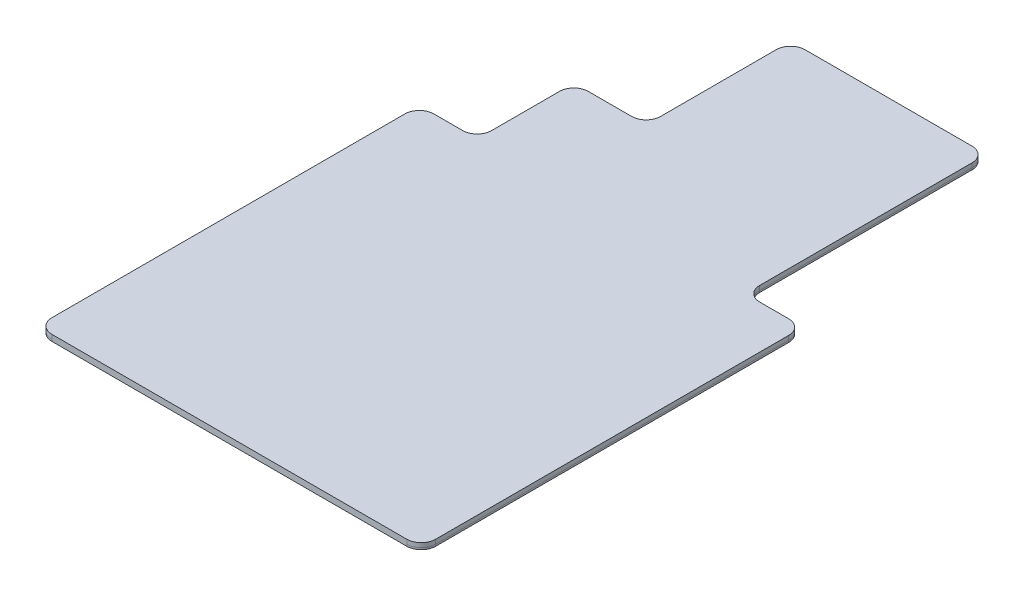
ISO-10303-21;
HEADER;
FILE_DESCRIPTION(('STEP AP214'),'2;1');
FILE_NAME('part.step','',(''),(''),'','','');
FILE_SCHEMA(('AUTOMOTIVE_DESIGN { 1 0 10303 214 1 1 1 1 }'));
ENDSEC;
DATA;
#1=APPLICATION_CONTEXT('core data for automotive mechanical design processes');
#2=APPLICATION_PROTOCOL_DEFINITION('international standard','automotive_design',2000,#1);
#3=PRODUCT_CONTEXT('',#1,'mechanical');
#4=PRODUCT('Part','Part','',(#3));
#5=PRODUCT_RELATED_PRODUCT_CATEGORY('part','',(#4));
#6=PRODUCT_DEFINITION_FORMATION('','',#4);
#7=PRODUCT_DEFINITION_CONTEXT('part definition',#1,'design');
#8=PRODUCT_DEFINITION('design','',#6,#7);
#9=PRODUCT_DEFINITION_SHAPE('','',#8);
#10=(LENGTH_UNIT() NAMED_UNIT(*) SI_UNIT(.MILLI.,.METRE.));
#11=(NAMED_UNIT(*) PLANE_ANGLE_UNIT() SI_UNIT($,.RADIAN.));
#12=(NAMED_UNIT(*) SI_UNIT($,.STERADIAN.) SOLID_ANGLE_UNIT());
#13=UNCERTAINTY_MEASURE_WITH_UNIT(LENGTH_MEASURE(1.E-05),#10,'distance_accuracy_value','');
#14=(GEOMETRIC_REPRESENTATION_CONTEXT(3) GLOBAL_UNCERTAINTY_ASSIGNED_CONTEXT((#13)) GLOBAL_UNIT_ASSIGNED_CONTEXT((#10,
#11,#12)) REPRESENTATION_CONTEXT('',''));
#15=CARTESIAN_POINT('',(0.,0.,0.));
#16=DIRECTION('',(0.,0.,1.));
#17=DIRECTION('',(1.,0.,0.));
#18=AXIS2_PLACEMENT_3D('',#15,#16,#17);
#19=CARTESIAN_POINT('',(-3.24677508544398,28.24732,30.4175989851035));
#20=DIRECTION('',(0.,1.,0.));
#21=DIRECTION('',(0.,0.,1.));
#22=AXIS2_PLACEMENT_3D('',#19,#20,#21);
#23=CYLINDRICAL_SURFACE('',#22,1.);
#24=DIRECTION('',(0.,1.,0.));
#25=VECTOR('',#24,1.);
#26=CARTESIAN_POINT('',(-4.24677508544398,27.82232,30.4175989851035));
#27=LINE('',#26,#25);
#28=CARTESIAN_POINT('',(-4.24677508544398,27.94732,30.4175989851035));
#29=VERTEX_POINT('',#28);
#30=CARTESIAN_POINT('',(-4.24677508544398,27.82232,30.4175989851035));
#31=VERTEX_POINT('',#30);
#32=EDGE_CURVE('E437',#29,#31,#27,.F.);
#33=ORIENTED_EDGE('',*,*,#32,.F.);
#34=CARTESIAN_POINT('',(-3.24677508544398,27.94732,30.4175989851035));
#35=DIRECTION('',(0.,1.,0.));
#36=DIRECTION('',(0.,0.,1.));
#37=AXIS2_PLACEMENT_3D('',#34,#35,#36);
#38=CIRCLE('',#37,1.);
#39=CARTESIAN_POINT('',(-3.24677508544398,27.94732,29.4175989851035));
#40=VERTEX_POINT('',#39);
#41=EDGE_CURVE('E11',#29,#40,#38,.F.);
#42=ORIENTED_EDGE('',*,*,#41,.T.);
#43=DIRECTION('',(0.,1.,0.));
#44=VECTOR('',#43,1.);
#45=CARTESIAN_POINT('',(-3.24677508544398,28.24732,29.4175989851035));
#46=LINE('',#45,#44);
#47=CARTESIAN_POINT('',(-3.24677508544398,27.82232,29.4175989851035));
#48=VERTEX_POINT('',#47);
#49=EDGE_CURVE('E466',#48,#40,#46,.T.);
#50=ORIENTED_EDGE('',*,*,#49,.F.);
#51=CARTESIAN_POINT('',(-3.24677508544398,27.82232,30.4175989851035));
#52=DIRECTION('',(0.,-1.,0.));
#53=DIRECTION('',(0.,0.,-1.));
#54=AXIS2_PLACEMENT_3D('',#51,#52,#53);
#55=CIRCLE('',#54,1.);
#56=EDGE_CURVE('E313',#31,#48,#55,.T.);
#57=ORIENTED_EDGE('',*,*,#56,.F.);
#58=EDGE_LOOP('',(#33,#42,#50,#57));
#59=FACE_BOUND('',#58,.T.);
#60=ADVANCED_FACE('F16',(#59),#23,.T.);
#61=CARTESIAN_POINT('',(-4.24677508544398,27.82232,29.4175989851035));
#62=DIRECTION('',(1.,0.,0.));
#63=DIRECTION('',(0.,0.,-1.));
#64=AXIS2_PLACEMENT_3D('',#61,#62,#63);
#65=PLANE('',#64);
#66=DIRECTION('',(0.,0.,1.));
#67=VECTOR('',#66,1.);
#68=CARTESIAN_POINT('',(-4.24677508544398,27.94732,29.4175989851035));
#69=LINE('',#68,#67);
#70=CARTESIAN_POINT('',(-4.24677508544398,27.94732,38.4175989851035));
#71=VERTEX_POINT('',#70);
#72=EDGE_CURVE('E25',#29,#71,#69,.T.);
#73=ORIENTED_EDGE('',*,*,#72,.F.);
#74=ORIENTED_EDGE('',*,*,#32,.T.);
#75=DIRECTION('',(0.,0.,-1.));
#76=VECTOR('',#75,1.);
#77=CARTESIAN_POINT('',(-4.24677508544398,27.82232,29.4175989851035));
#78=LINE('',#77,#76);
#79=CARTESIAN_POINT('',(-4.24677508544398,27.82232,38.4175989851035));
#80=VERTEX_POINT('',#79);
#81=EDGE_CURVE('E459',#80,#31,#78,.T.);
#82=ORIENTED_EDGE('',*,*,#81,.F.);
#83=DIRECTION('',(0.,1.,0.));
#84=VECTOR('',#83,1.);
#85=CARTESIAN_POINT('',(-4.24677508544398,28.24732,38.4175989851035));
#86=LINE('',#85,#84);
#87=EDGE_CURVE('E434',#80,#71,#86,.T.);
#88=ORIENTED_EDGE('',*,*,#87,.T.);
#89=EDGE_LOOP('',(#73,#74,#82,#88));
#90=FACE_BOUND('',#89,.T.);
#91=ADVANCED_FACE('F540',(#90),#65,.F.);
#92=CARTESIAN_POINT('',(-5.24677508544398,27.82232,38.4175989851035));
#93=DIRECTION('',(0.,-1.,0.));
#94=DIRECTION('',(0.,0.,-1.));
#95=AXIS2_PLACEMENT_3D('',#92,#93,#94);
#96=CYLINDRICAL_SURFACE('',#95,1.);
#97=CARTESIAN_POINT('',(-5.24677508544398,27.94732,38.4175989851035));
#98=DIRECTION('',(0.,1.,0.));
#99=DIRECTION('',(0.,0.,1.));
#100=AXIS2_PLACEMENT_3D('',#97,#98,#99);
#101=CIRCLE('',#100,1.);
#102=CARTESIAN_POINT('',(-5.24677508544398,27.94732,39.4175989851035));
#103=VERTEX_POINT('',#102);
#104=EDGE_CURVE('E288',#71,#103,#101,.F.);
#105=ORIENTED_EDGE('',*,*,#104,.F.);
#106=ORIENTED_EDGE('',*,*,#87,.F.);
#107=CARTESIAN_POINT('',(-5.24677508544398,27.82232,38.4175989851035));
#108=DIRECTION('',(0.,-1.,0.));
#109=DIRECTION('',(0.,0.,-1.));
#110=AXIS2_PLACEMENT_3D('',#107,#108,#109);
#111=CIRCLE('',#110,1.);
#112=CARTESIAN_POINT('',(-5.24677508544398,27.82232,39.4175989851035));
#113=VERTEX_POINT('',#112);
#114=EDGE_CURVE('E380',#113,#80,#111,.F.);
#115=ORIENTED_EDGE('',*,*,#114,.F.);
#116=DIRECTION('',(0.,1.,0.));
#117=VECTOR('',#116,1.);
#118=CARTESIAN_POINT('',(-5.24677508544398,27.82232,39.4175989851035));
#119=LINE('',#118,#117);
#120=EDGE_CURVE('E321',#103,#113,#119,.F.);
#121=ORIENTED_EDGE('',*,*,#120,.F.);
#122=EDGE_LOOP('',(#105,#106,#115,#121));
#123=FACE_BOUND('',#122,.T.);
#124=ADVANCED_FACE('F537',(#123),#96,.F.);
#125=CARTESIAN_POINT('',(-9.24677508544398,27.82232,39.4175989851035));
#126=DIRECTION('',(0.,0.,1.));
#127=DIRECTION('',(1.,0.,0.));
#128=AXIS2_PLACEMENT_3D('',#125,#126,#127);
#129=PLANE('',#128);
#130=DIRECTION('',(-1.,0.,0.));
#131=VECTOR('',#130,1.);
#132=CARTESIAN_POINT('',(-9.24677508544398,27.94732,39.4175989851035));
#133=LINE('',#132,#131);
#134=CARTESIAN_POINT('',(-8.24677508544398,27.94732,39.4175989851035));
#135=VERTEX_POINT('',#134);
#136=EDGE_CURVE('E289',#103,#135,#133,.T.);
#137=ORIENTED_EDGE('',*,*,#136,.F.);
#138=ORIENTED_EDGE('',*,*,#120,.T.);
#139=DIRECTION('',(1.,0.,0.));
#140=VECTOR('',#139,1.);
#141=CARTESIAN_POINT('',(-9.24677508544398,27.82232,39.4175989851035));
#142=LINE('',#141,#140);
#143=CARTESIAN_POINT('',(-8.24677508544398,27.82232,39.4175989851035));
#144=VERTEX_POINT('',#143);
#145=EDGE_CURVE('E320',#144,#113,#142,.T.);
#146=ORIENTED_EDGE('',*,*,#145,.F.);
#147=DIRECTION('',(0.,1.,0.));
#148=VECTOR('',#147,1.);
#149=CARTESIAN_POINT('',(-8.24677508544398,27.82232,39.4175989851035));
#150=LINE('',#149,#148);
#151=EDGE_CURVE('E301',#144,#135,#150,.T.);
#152=ORIENTED_EDGE('',*,*,#151,.T.);
#153=EDGE_LOOP('',(#137,#138,#146,#152));
#154=FACE_BOUND('',#153,.T.);
#155=ADVANCED_FACE('F317',(#154),#129,.F.);
#156=CARTESIAN_POINT('',(-8.24677508544398,27.82232,40.4175989851035));
#157=DIRECTION('',(0.,1.,0.));
#158=DIRECTION('',(0.,0.,1.));
#159=AXIS2_PLACEMENT_3D('',#156,#157,#158);
#160=CYLINDRICAL_SURFACE('',#159,1.);
#161=DIRECTION('',(0.,1.,0.));
#162=VECTOR('',#161,1.);
#163=CARTESIAN_POINT('',(-9.24677508544398,28.24732,40.4175989851035));
#164=LINE('',#163,#162);
#165=CARTESIAN_POINT('',(-9.24677508544398,27.94732,40.4175989851035));
#166=VERTEX_POINT('',#165);
#167=CARTESIAN_POINT('',(-9.24677508544398,27.82232,40.4175989851035));
#168=VERTEX_POINT('',#167);
#169=EDGE_CURVE('E302',#166,#168,#164,.F.);
#170=ORIENTED_EDGE('',*,*,#169,.F.);
#171=CARTESIAN_POINT('',(-8.24677508544398,27.94732,40.4175989851035));
#172=DIRECTION('',(0.,1.,0.));
#173=DIRECTION('',(0.,0.,1.));
#174=AXIS2_PLACEMENT_3D('',#171,#172,#173);
#175=CIRCLE('',#174,1.);
#176=EDGE_CURVE('E234',#166,#135,#175,.F.);
#177=ORIENTED_EDGE('',*,*,#176,.T.);
#178=ORIENTED_EDGE('',*,*,#151,.F.);
#179=CARTESIAN_POINT('',(-8.24677508544398,27.82232,40.4175989851035));
#180=DIRECTION('',(0.,-1.,0.));
#181=DIRECTION('',(0.,0.,-1.));
#182=AXIS2_PLACEMENT_3D('',#179,#180,#181);
#183=CIRCLE('',#182,1.);
#184=EDGE_CURVE('E449',#168,#144,#183,.T.);
#185=ORIENTED_EDGE('',*,*,#184,.F.);
#186=EDGE_LOOP('',(#170,#177,#178,#185));
#187=FACE_BOUND('',#186,.T.);
#188=ADVANCED_FACE('F298',(#187),#160,.T.);
#189=CARTESIAN_POINT('',(12.311291085444,28.24732,71.54165));
#190=DIRECTION('',(0.,-1.,0.));
#191=DIRECTION('',(0.,0.,-1.));
#192=AXIS2_PLACEMENT_3D('',#189,#190,#191);
#193=CYLINDRICAL_SURFACE('',#192,1.);
#194=DIRECTION('',(0.,-1.,0.));
#195=VECTOR('',#194,1.);
#196=CARTESIAN_POINT('',(13.311291085444,28.24732,71.54165));
#197=LINE('',#196,#195);
#198=CARTESIAN_POINT('',(13.311291085444,27.94732,71.54165));
#199=VERTEX_POINT('',#198);
#200=CARTESIAN_POINT('',(13.311291085444,27.82232,71.54165));
#201=VERTEX_POINT('',#200);
#202=EDGE_CURVE('E340',#199,#201,#197,.T.);
#203=ORIENTED_EDGE('',*,*,#202,.F.);
#204=CARTESIAN_POINT('',(12.311291085444,27.94732,71.54165));
#205=DIRECTION('',(0.,1.,0.));
#206=DIRECTION('',(0.,0.,1.));
#207=AXIS2_PLACEMENT_3D('',#204,#205,#206);
#208=CIRCLE('',#207,1.);
#209=CARTESIAN_POINT('',(12.311291085444,27.94732,72.54165));
#210=VERTEX_POINT('',#209);
#211=EDGE_CURVE('E229',#199,#210,#208,.F.);
#212=ORIENTED_EDGE('',*,*,#211,.T.);
#213=DIRECTION('',(0.,-1.,0.));
#214=VECTOR('',#213,1.);
#215=CARTESIAN_POINT('',(12.311291085444,28.24732,72.54165));
#216=LINE('',#215,#214);
#217=CARTESIAN_POINT('',(12.311291085444,27.82232,72.54165));
#218=VERTEX_POINT('',#217);
#219=EDGE_CURVE('E373',#218,#210,#216,.F.);
#220=ORIENTED_EDGE('',*,*,#219,.F.);
#221=CARTESIAN_POINT('',(12.311291085444,27.82232,71.54165));
#222=DIRECTION('',(0.,-1.,0.));
#223=DIRECTION('',(0.,0.,-1.));
#224=AXIS2_PLACEMENT_3D('',#221,#222,#223);
#225=CIRCLE('',#224,1.);
#226=EDGE_CURVE('E442',#201,#218,#225,.T.);
#227=ORIENTED_EDGE('',*,*,#226,.F.);
#228=EDGE_LOOP('',(#203,#212,#220,#227));
#229=FACE_BOUND('',#228,.T.);
#230=ADVANCED_FACE('F498',(#229),#193,.T.);
#231=CARTESIAN_POINT('',(13.311291085444,28.24732,72.54165));
#232=DIRECTION('',(-1.,0.,0.));
#233=DIRECTION('',(0.,0.,1.));
#234=AXIS2_PLACEMENT_3D('',#231,#232,#233);
#235=PLANE('',#234);
#236=DIRECTION('',(0.,0.,-1.));
#237=VECTOR('',#236,1.);
#238=CARTESIAN_POINT('',(13.311291085444,27.94732,72.54165));
#239=LINE('',#238,#237);
#240=CARTESIAN_POINT('',(13.311291085444,27.94732,47.1117784768324));
#241=VERTEX_POINT('',#240);
#242=EDGE_CURVE('E226',#199,#241,#239,.T.);
#243=ORIENTED_EDGE('',*,*,#242,.F.);
#244=ORIENTED_EDGE('',*,*,#202,.T.);
#245=DIRECTION('',(0.,0.,-1.));
#246=VECTOR('',#245,1.);
#247=CARTESIAN_POINT('',(13.311291085444,27.82232,72.54165));
#248=LINE('',#247,#246);
#249=CARTESIAN_POINT('',(13.311291085444,27.82232,47.1117784768324));
#250=VERTEX_POINT('',#249);
#251=EDGE_CURVE('E501',#201,#250,#248,.T.);
#252=ORIENTED_EDGE('',*,*,#251,.T.);
#253=DIRECTION('',(0.,-1.,0.));
#254=VECTOR('',#253,1.);
#255=CARTESIAN_POINT('',(13.311291085444,28.24732,47.1117784768324));
#256=LINE('',#255,#254);
#257=EDGE_CURVE('E345',#250,#241,#256,.F.);
#258=ORIENTED_EDGE('',*,*,#257,.T.);
#259=EDGE_LOOP('',(#243,#244,#252,#258));
#260=FACE_BOUND('',#259,.T.);
#261=ADVANCED_FACE('F495',(#260),#235,.F.);
#262=CARTESIAN_POINT('',(-12.246775085444,28.24732,71.54165));
#263=DIRECTION('',(0.,-1.,0.));
#264=DIRECTION('',(0.,0.,-1.));
#265=AXIS2_PLACEMENT_3D('',#262,#263,#264);
#266=CYLINDRICAL_SURFACE('',#265,1.);
#267=DIRECTION('',(0.,-1.,0.));
#268=VECTOR('',#267,1.);
#269=CARTESIAN_POINT('',(-12.246775085444,28.24732,72.54165));
#270=LINE('',#269,#268);
#271=CARTESIAN_POINT('',(-12.246775085444,27.94732,72.54165));
#272=VERTEX_POINT('',#271);
#273=CARTESIAN_POINT('',(-12.246775085444,27.82232,72.54165));
#274=VERTEX_POINT('',#273);
#275=EDGE_CURVE('E376',#272,#274,#270,.T.);
#276=ORIENTED_EDGE('',*,*,#275,.F.);
#277=CARTESIAN_POINT('',(-12.246775085444,27.94732,71.54165));
#278=DIRECTION('',(0.,1.,0.));
#279=DIRECTION('',(0.,0.,1.));
#280=AXIS2_PLACEMENT_3D('',#277,#278,#279);
#281=CIRCLE('',#280,1.);
#282=CARTESIAN_POINT('',(-13.246775085444,27.94732,71.54165));
#283=VERTEX_POINT('',#282);
#284=EDGE_CURVE('E227',#272,#283,#281,.F.);
#285=ORIENTED_EDGE('',*,*,#284,.T.);
#286=DIRECTION('',(0.,-1.,0.));
#287=VECTOR('',#286,1.);
#288=CARTESIAN_POINT('',(-13.246775085444,28.24732,71.54165));
#289=LINE('',#288,#287);
#290=CARTESIAN_POINT('',(-13.246775085444,27.82232,71.54165));
#291=VERTEX_POINT('',#290);
#292=EDGE_CURVE('E357',#291,#283,#289,.F.);
#293=ORIENTED_EDGE('',*,*,#292,.F.);
#294=CARTESIAN_POINT('',(-12.246775085444,27.82232,71.54165));
#295=DIRECTION('',(0.,-1.,0.));
#296=DIRECTION('',(0.,0.,-1.));
#297=AXIS2_PLACEMENT_3D('',#294,#295,#296);
#298=CIRCLE('',#297,1.);
#299=EDGE_CURVE('E440',#274,#291,#298,.T.);
#300=ORIENTED_EDGE('',*,*,#299,.F.);
#301=EDGE_LOOP('',(#276,#285,#293,#300));
#302=FACE_BOUND('',#301,.T.);
#303=ADVANCED_FACE('F623',(#302),#266,.T.);
#304=CARTESIAN_POINT('',(-13.246775085444,28.24732,72.54165));
#305=DIRECTION('',(1.,0.,0.));
#306=DIRECTION('',(0.,0.,-1.));
#307=AXIS2_PLACEMENT_3D('',#304,#305,#306);
#308=PLANE('',#307);
#309=DIRECTION('',(0.,0.,1.));
#310=VECTOR('',#309,1.);
#311=CARTESIAN_POINT('',(-13.246775085444,27.94732,72.54165));
#312=LINE('',#311,#310);
#313=CARTESIAN_POINT('',(-13.246775085444,27.94732,47.1117784768324));
#314=VERTEX_POINT('',#313);
#315=EDGE_CURVE('E231',#314,#283,#312,.T.);
#316=ORIENTED_EDGE('',*,*,#315,.F.);
#317=DIRECTION('',(0.,-1.,0.));
#318=VECTOR('',#317,1.);
#319=CARTESIAN_POINT('',(-13.246775085444,28.24732,47.1117784768324));
#320=LINE('',#319,#318);
#321=CARTESIAN_POINT('',(-13.246775085444,27.82232,47.1117784768324));
#322=VERTEX_POINT('',#321);
#323=EDGE_CURVE('E360',#314,#322,#320,.T.);
#324=ORIENTED_EDGE('',*,*,#323,.T.);
#325=DIRECTION('',(0.,0.,1.));
#326=VECTOR('',#325,1.);
#327=CARTESIAN_POINT('',(-13.246775085444,27.82232,72.54165));
#328=LINE('',#327,#326);
#329=EDGE_CURVE('E507',#322,#291,#328,.T.);
#330=ORIENTED_EDGE('',*,*,#329,.T.);
#331=ORIENTED_EDGE('',*,*,#292,.T.);
#332=EDGE_LOOP('',(#316,#324,#330,#331));
#333=FACE_BOUND('',#332,.T.);
#334=ADVANCED_FACE('F634',(#333),#308,.F.);
#335=CARTESIAN_POINT('',(-12.246775085444,28.24732,47.1117784768324));
#336=DIRECTION('',(0.,-1.,0.));
#337=DIRECTION('',(0.,0.,-1.));
#338=AXIS2_PLACEMENT_3D('',#335,#336,#337);
#339=CYLINDRICAL_SURFACE('',#338,1.);
#340=ORIENTED_EDGE('',*,*,#323,.F.);
#341=CARTESIAN_POINT('',(-12.246775085444,27.94732,47.1117784768324));
#342=DIRECTION('',(0.,1.,0.));
#343=DIRECTION('',(0.,0.,1.));
#344=AXIS2_PLACEMENT_3D('',#341,#342,#343);
#345=CIRCLE('',#344,1.);
#346=CARTESIAN_POINT('',(-12.246775085444,27.94732,46.1117784768324));
#347=VERTEX_POINT('',#346);
#348=EDGE_CURVE('E239',#314,#347,#345,.F.);
#349=ORIENTED_EDGE('',*,*,#348,.T.);
#350=DIRECTION('',(0.,-1.,0.));
#351=VECTOR('',#350,1.);
#352=CARTESIAN_POINT('',(-12.246775085444,28.24732,46.1117784768324));
#353=LINE('',#352,#351);
#354=CARTESIAN_POINT('',(-12.246775085444,27.82232,46.1117784768324));
#355=VERTEX_POINT('',#354);
#356=EDGE_CURVE('E369',#355,#347,#353,.F.);
#357=ORIENTED_EDGE('',*,*,#356,.F.);
#358=CARTESIAN_POINT('',(-12.246775085444,27.82232,47.1117784768324));
#359=DIRECTION('',(0.,-1.,0.));
#360=DIRECTION('',(0.,0.,-1.));
#361=AXIS2_PLACEMENT_3D('',#358,#359,#360);
#362=CIRCLE('',#361,1.);
#363=EDGE_CURVE('E444',#322,#355,#362,.T.);
#364=ORIENTED_EDGE('',*,*,#363,.F.);
#365=EDGE_LOOP('',(#340,#349,#357,#364));
#366=FACE_BOUND('',#365,.T.);
#367=ADVANCED_FACE('F613',(#366),#339,.T.);
#368=CARTESIAN_POINT('',(-13.246775085444,28.24732,46.1117784768324));
#369=DIRECTION('',(0.,0.,1.));
#370=DIRECTION('',(1.,0.,0.));
#371=AXIS2_PLACEMENT_3D('',#368,#369,#370);
#372=PLANE('',#371);
#373=DIRECTION('',(-1.,0.,0.));
#374=VECTOR('',#373,1.);
#375=CARTESIAN_POINT('',(-13.246775085444,27.94732,46.1117784768324));
#376=LINE('',#375,#374);
#377=CARTESIAN_POINT('',(-10.246775085444,27.94732,46.1117784768324));
#378=VERTEX_POINT('',#377);
#379=EDGE_CURVE('E241',#378,#347,#376,.T.);
#380=ORIENTED_EDGE('',*,*,#379,.F.);
#381=DIRECTION('',(0.,-1.,0.));
#382=VECTOR('',#381,1.);
#383=CARTESIAN_POINT('',(-10.246775085444,27.82232,46.1117784768324));
#384=LINE('',#383,#382);
#385=CARTESIAN_POINT('',(-10.246775085444,27.82232,46.1117784768324));
#386=VERTEX_POINT('',#385);
#387=EDGE_CURVE('E364',#378,#386,#384,.T.);
#388=ORIENTED_EDGE('',*,*,#387,.T.);
#389=DIRECTION('',(-1.,0.,0.));
#390=VECTOR('',#389,1.);
#391=CARTESIAN_POINT('',(-13.246775085444,27.82232,46.1117784768324));
#392=LINE('',#391,#390);
#393=EDGE_CURVE('E512',#386,#355,#392,.T.);
#394=ORIENTED_EDGE('',*,*,#393,.T.);
#395=ORIENTED_EDGE('',*,*,#356,.T.);
#396=EDGE_LOOP('',(#380,#388,#394,#395));
#397=FACE_BOUND('',#396,.T.);
#398=ADVANCED_FACE('F655',(#397),#372,.F.);
#399=CARTESIAN_POINT('',(-10.246775085444,28.24732,45.1117784768324));
#400=DIRECTION('',(0.,1.,0.));
#401=DIRECTION('',(0.,0.,1.));
#402=AXIS2_PLACEMENT_3D('',#399,#400,#401);
#403=CYLINDRICAL_SURFACE('',#402,1.);
#404=CARTESIAN_POINT('',(-10.246775085444,27.94732,45.1117784768324));
#405=DIRECTION('',(0.,1.,0.));
#406=DIRECTION('',(0.,0.,1.));
#407=AXIS2_PLACEMENT_3D('',#404,#405,#406);
#408=CIRCLE('',#407,1.);
#409=CARTESIAN_POINT('',(-9.24677508544398,27.94732,45.1117784768324));
#410=VERTEX_POINT('',#409);
#411=EDGE_CURVE('E244',#410,#378,#408,.F.);
#412=ORIENTED_EDGE('',*,*,#411,.F.);
#413=DIRECTION('',(0.,-1.,0.));
#414=VECTOR('',#413,1.);
#415=CARTESIAN_POINT('',(-9.24677508544398,28.24732,45.1117784768324));
#416=LINE('',#415,#414);
#417=CARTESIAN_POINT('',(-9.24677508544398,27.82232,45.1117784768324));
#418=VERTEX_POINT('',#417);
#419=EDGE_CURVE('E328',#418,#410,#416,.F.);
#420=ORIENTED_EDGE('',*,*,#419,.F.);
#421=CARTESIAN_POINT('',(-10.246775085444,27.82232,45.1117784768324));
#422=DIRECTION('',(0.,-1.,0.));
#423=DIRECTION('',(0.,0.,-1.));
#424=AXIS2_PLACEMENT_3D('',#421,#422,#423);
#425=CIRCLE('',#424,1.);
#426=EDGE_CURVE('E274',#386,#418,#425,.F.);
#427=ORIENTED_EDGE('',*,*,#426,.F.);
#428=ORIENTED_EDGE('',*,*,#387,.F.);
#429=EDGE_LOOP('',(#412,#420,#427,#428));
#430=FACE_BOUND('',#429,.T.);
#431=ADVANCED_FACE('F616',(#430),#403,.F.);
#432=CARTESIAN_POINT('',(-9.24677508544398,28.24732,46.1117784768324));
#433=DIRECTION('',(1.,0.,0.));
#434=DIRECTION('',(0.,0.,-1.));
#435=AXIS2_PLACEMENT_3D('',#432,#433,#434);
#436=PLANE('',#435);
#437=DIRECTION('',(0.,0.,1.));
#438=VECTOR('',#437,1.);
#439=CARTESIAN_POINT('',(-9.24677508544398,27.94732,46.1117784768324));
#440=LINE('',#439,#438);
#441=EDGE_CURVE('E247',#166,#410,#440,.T.);
#442=ORIENTED_EDGE('',*,*,#441,.F.);
#443=ORIENTED_EDGE('',*,*,#169,.T.);
#444=DIRECTION('',(0.,0.,1.));
#445=VECTOR('',#444,1.);
#446=CARTESIAN_POINT('',(-9.24677508544398,27.82232,46.1117784768324));
#447=LINE('',#446,#445);
#448=EDGE_CURVE('E469',#168,#418,#447,.T.);
#449=ORIENTED_EDGE('',*,*,#448,.T.);
#450=ORIENTED_EDGE('',*,*,#419,.T.);
#451=EDGE_LOOP('',(#442,#443,#449,#450));
#452=FACE_BOUND('',#451,.T.);
#453=ADVANCED_FACE('F559',(#452),#436,.F.);
#454=CARTESIAN_POINT('',(-9.24677508544398,28.24732,29.4175989851035));
#455=DIRECTION('',(0.,0.,1.));
#456=DIRECTION('',(1.,0.,0.));
#457=AXIS2_PLACEMENT_3D('',#454,#455,#456);
#458=PLANE('',#457);
#459=DIRECTION('',(-1.,0.,0.));
#460=VECTOR('',#459,1.);
#461=CARTESIAN_POINT('',(-9.24677508544398,27.94732,29.4175989851035));
#462=LINE('',#461,#460);
#463=CARTESIAN_POINT('',(8.31129108544402,27.94732,29.4175989851035));
#464=VERTEX_POINT('',#463);
#465=EDGE_CURVE('E250',#464,#40,#462,.T.);
#466=ORIENTED_EDGE('',*,*,#465,.F.);
#467=DIRECTION('',(0.,-1.,0.));
#468=VECTOR('',#467,1.);
#469=CARTESIAN_POINT('',(8.31129108544402,28.24732,29.4175989851035));
#470=LINE('',#469,#468);
#471=CARTESIAN_POINT('',(8.31129108544402,27.82232,29.4175989851035));
#472=VERTEX_POINT('',#471);
#473=EDGE_CURVE('E467',#464,#472,#470,.T.);
#474=ORIENTED_EDGE('',*,*,#473,.T.);
#475=DIRECTION('',(-1.,0.,0.));
#476=VECTOR('',#475,1.);
#477=CARTESIAN_POINT('',(-9.24677508544398,27.82232,29.4175989851035));
#478=LINE('',#477,#476);
#479=EDGE_CURVE('E457',#472,#48,#478,.T.);
#480=ORIENTED_EDGE('',*,*,#479,.T.);
#481=ORIENTED_EDGE('',*,*,#49,.T.);
#482=EDGE_LOOP('',(#466,#474,#480,#481));
#483=FACE_BOUND('',#482,.T.);
#484=ADVANCED_FACE('F465',(#483),#458,.F.);
#485=CARTESIAN_POINT('',(8.31129108544402,28.24732,30.4175989851035));
#486=DIRECTION('',(0.,-1.,0.));
#487=DIRECTION('',(0.,0.,-1.));
#488=AXIS2_PLACEMENT_3D('',#485,#486,#487);
#489=CYLINDRICAL_SURFACE('',#488,1.);
#490=ORIENTED_EDGE('',*,*,#473,.F.);
#491=CARTESIAN_POINT('',(8.31129108544402,27.94732,30.4175989851035));
#492=DIRECTION('',(0.,1.,0.));
#493=DIRECTION('',(0.,0.,1.));
#494=AXIS2_PLACEMENT_3D('',#491,#492,#493);
#495=CIRCLE('',#494,1.);
#496=CARTESIAN_POINT('',(9.31129108544402,27.94732,30.4175989851035));
#497=VERTEX_POINT('',#496);
#498=EDGE_CURVE('E255',#464,#497,#495,.F.);
#499=ORIENTED_EDGE('',*,*,#498,.T.);
#500=DIRECTION('',(0.,-1.,0.));
#501=VECTOR('',#500,1.);
#502=CARTESIAN_POINT('',(9.31129108544402,28.24732,30.4175989851035));
#503=LINE('',#502,#501);
#504=CARTESIAN_POINT('',(9.31129108544402,27.82232,30.4175989851035));
#505=VERTEX_POINT('',#504);
#506=EDGE_CURVE('E349',#505,#497,#503,.F.);
#507=ORIENTED_EDGE('',*,*,#506,.F.);
#508=CARTESIAN_POINT('',(8.31129108544402,27.82232,30.4175989851035));
#509=DIRECTION('',(0.,-1.,0.));
#510=DIRECTION('',(0.,0.,-1.));
#511=AXIS2_PLACEMENT_3D('',#508,#509,#510);
#512=CIRCLE('',#511,1.);
#513=EDGE_CURVE('E446',#472,#505,#512,.T.);
#514=ORIENTED_EDGE('',*,*,#513,.F.);
#515=EDGE_LOOP('',(#490,#499,#507,#514));
#516=FACE_BOUND('',#515,.T.);
#517=ADVANCED_FACE('F563',(#516),#489,.T.);
#518=CARTESIAN_POINT('',(9.31129108544402,28.24732,46.1117784768324));
#519=DIRECTION('',(-1.,0.,0.));
#520=DIRECTION('',(0.,0.,1.));
#521=AXIS2_PLACEMENT_3D('',#518,#519,#520);
#522=PLANE('',#521);
#523=DIRECTION('',(0.,0.,-1.));
#524=VECTOR('',#523,1.);
#525=CARTESIAN_POINT('',(9.31129108544402,27.94732,46.1117784768324));
#526=LINE('',#525,#524);
#527=CARTESIAN_POINT('',(9.31129108544402,27.94732,45.1117784768324));
#528=VERTEX_POINT('',#527);
#529=EDGE_CURVE('E257',#528,#497,#526,.T.);
#530=ORIENTED_EDGE('',*,*,#529,.F.);
#531=DIRECTION('',(0.,-1.,0.));
#532=VECTOR('',#531,1.);
#533=CARTESIAN_POINT('',(9.31129108544402,27.82232,45.1117784768324));
#534=LINE('',#533,#532);
#535=CARTESIAN_POINT('',(9.31129108544402,27.82232,45.1117784768324));
#536=VERTEX_POINT('',#535);
#537=EDGE_CURVE('E352',#528,#536,#534,.T.);
#538=ORIENTED_EDGE('',*,*,#537,.T.);
#539=DIRECTION('',(0.,0.,-1.));
#540=VECTOR('',#539,1.);
#541=CARTESIAN_POINT('',(9.31129108544402,27.82232,46.1117784768324));
#542=LINE('',#541,#540);
#543=EDGE_CURVE('E410',#536,#505,#542,.T.);
#544=ORIENTED_EDGE('',*,*,#543,.T.);
#545=ORIENTED_EDGE('',*,*,#506,.T.);
#546=EDGE_LOOP('',(#530,#538,#544,#545));
#547=FACE_BOUND('',#546,.T.);
#548=ADVANCED_FACE('F409',(#547),#522,.F.);
#549=CARTESIAN_POINT('',(10.311291085444,28.24732,45.1117784768324));
#550=DIRECTION('',(0.,1.,0.));
#551=DIRECTION('',(0.,0.,1.));
#552=AXIS2_PLACEMENT_3D('',#549,#550,#551);
#553=CYLINDRICAL_SURFACE('',#552,1.);
#554=CARTESIAN_POINT('',(10.311291085444,27.94732,45.1117784768324));
#555=DIRECTION('',(0.,1.,0.));
#556=DIRECTION('',(0.,0.,1.));
#557=AXIS2_PLACEMENT_3D('',#554,#555,#556);
#558=CIRCLE('',#557,1.);
#559=CARTESIAN_POINT('',(10.311291085444,27.94732,46.1117784768324));
#560=VERTEX_POINT('',#559);
#561=EDGE_CURVE('E260',#560,#528,#558,.F.);
#562=ORIENTED_EDGE('',*,*,#561,.F.);
#563=DIRECTION('',(0.,-1.,0.));
#564=VECTOR('',#563,1.);
#565=CARTESIAN_POINT('',(10.311291085444,28.24732,46.1117784768324));
#566=LINE('',#565,#564);
#567=CARTESIAN_POINT('',(10.311291085444,27.82232,46.1117784768324));
#568=VERTEX_POINT('',#567);
#569=EDGE_CURVE('E334',#568,#560,#566,.F.);
#570=ORIENTED_EDGE('',*,*,#569,.F.);
#571=CARTESIAN_POINT('',(10.311291085444,27.82232,45.1117784768324));
#572=DIRECTION('',(0.,-1.,0.));
#573=DIRECTION('',(0.,0.,-1.));
#574=AXIS2_PLACEMENT_3D('',#571,#572,#573);
#575=CIRCLE('',#574,1.);
#576=EDGE_CURVE('E382',#536,#568,#575,.F.);
#577=ORIENTED_EDGE('',*,*,#576,.F.);
#578=ORIENTED_EDGE('',*,*,#537,.F.);
#579=EDGE_LOOP('',(#562,#570,#577,#578));
#580=FACE_BOUND('',#579,.T.);
#581=ADVANCED_FACE('F405',(#580),#553,.F.);
#582=CARTESIAN_POINT('',(12.311291085444,28.24732,47.1117784768324));
#583=DIRECTION('',(0.,-1.,0.));
#584=DIRECTION('',(0.,0.,-1.));
#585=AXIS2_PLACEMENT_3D('',#582,#583,#584);
#586=CYLINDRICAL_SURFACE('',#585,1.);
#587=DIRECTION('',(0.,-1.,0.));
#588=VECTOR('',#587,1.);
#589=CARTESIAN_POINT('',(12.311291085444,28.24732,46.1117784768324));
#590=LINE('',#589,#588);
#591=CARTESIAN_POINT('',(12.311291085444,27.94732,46.1117784768324));
#592=VERTEX_POINT('',#591);
#593=CARTESIAN_POINT('',(12.311291085444,27.82232,46.1117784768324));
#594=VERTEX_POINT('',#593);
#595=EDGE_CURVE('E337',#592,#594,#590,.T.);
#596=ORIENTED_EDGE('',*,*,#595,.F.);
#597=CARTESIAN_POINT('',(12.311291085444,27.94732,47.1117784768324));
#598=DIRECTION('',(0.,1.,0.));
#599=DIRECTION('',(0.,0.,1.));
#600=AXIS2_PLACEMENT_3D('',#597,#598,#599);
#601=CIRCLE('',#600,1.);
#602=EDGE_CURVE('E262',#592,#241,#601,.F.);
#603=ORIENTED_EDGE('',*,*,#602,.T.);
#604=ORIENTED_EDGE('',*,*,#257,.F.);
#605=CARTESIAN_POINT('',(12.311291085444,27.82232,47.1117784768324));
#606=DIRECTION('',(0.,-1.,0.));
#607=DIRECTION('',(0.,0.,-1.));
#608=AXIS2_PLACEMENT_3D('',#605,#606,#607);
#609=CIRCLE('',#608,1.);
#610=EDGE_CURVE('E448',#594,#250,#609,.T.);
#611=ORIENTED_EDGE('',*,*,#610,.F.);
#612=EDGE_LOOP('',(#596,#603,#604,#611));
#613=FACE_BOUND('',#612,.T.);
#614=ADVANCED_FACE('F603',(#613),#586,.T.);
#615=CARTESIAN_POINT('',(13.311291085444,28.24732,46.1117784768324));
#616=DIRECTION('',(0.,0.,1.));
#617=DIRECTION('',(1.,0.,0.));
#618=AXIS2_PLACEMENT_3D('',#615,#616,#617);
#619=PLANE('',#618);
#620=DIRECTION('',(-1.,0.,0.));
#621=VECTOR('',#620,1.);
#622=CARTESIAN_POINT('',(13.311291085444,27.94732,46.1117784768324));
#623=LINE('',#622,#621);
#624=EDGE_CURVE('E20',#592,#560,#623,.T.);
#625=ORIENTED_EDGE('',*,*,#624,.F.);
#626=ORIENTED_EDGE('',*,*,#595,.T.);
#627=DIRECTION('',(-1.,0.,0.));
#628=VECTOR('',#627,1.);
#629=CARTESIAN_POINT('',(13.311291085444,27.82232,46.1117784768324));
#630=LINE('',#629,#628);
#631=EDGE_CURVE('E398',#594,#568,#630,.T.);
#632=ORIENTED_EDGE('',*,*,#631,.T.);
#633=ORIENTED_EDGE('',*,*,#569,.T.);
#634=EDGE_LOOP('',(#625,#626,#632,#633));
#635=FACE_BOUND('',#634,.T.);
#636=ADVANCED_FACE('F560',(#635),#619,.F.);
#637=CARTESIAN_POINT('',(9.31129108544402,28.24732,45.1117784768324));
#638=VERTEX_POINT('',#637);
#639=EDGE_CURVE('E353',#638,#528,#534,.T.);
#640=ORIENTED_EDGE('',*,*,#639,.T.);
#641=ORIENTED_EDGE('',*,*,#529,.T.);
#642=CARTESIAN_POINT('',(9.31129108544402,28.24732,30.4175989851035));
#643=VERTEX_POINT('',#642);
#644=EDGE_CURVE('E348',#497,#643,#503,.F.);
#645=ORIENTED_EDGE('',*,*,#644,.T.);
#646=DIRECTION('',(0.,0.,-1.));
#647=VECTOR('',#646,1.);
#648=CARTESIAN_POINT('',(9.31129108544402,28.24732,46.1117784768324));
#649=LINE('',#648,#647);
#650=EDGE_CURVE('E388',#638,#643,#649,.T.);
#651=ORIENTED_EDGE('',*,*,#650,.F.);
#652=EDGE_LOOP('',(#640,#641,#645,#651));
#653=FACE_BOUND('',#652,.T.);
#654=ADVANCED_FACE('F395',(#653),#522,.F.);
#655=CARTESIAN_POINT('',(8.31129108544402,28.24732,29.4175989851035));
#656=VERTEX_POINT('',#655);
#657=EDGE_CURVE('E419',#656,#464,#470,.T.);
#658=ORIENTED_EDGE('',*,*,#657,.T.);
#659=ORIENTED_EDGE('',*,*,#465,.T.);
#660=CARTESIAN_POINT('',(-3.24677508544398,28.24732,29.4175989851035));
#661=VERTEX_POINT('',#660);
#662=EDGE_CURVE('E472',#40,#661,#46,.T.);
#663=ORIENTED_EDGE('',*,*,#662,.T.);
#664=DIRECTION('',(-1.,0.,0.));
#665=VECTOR('',#664,1.);
#666=CARTESIAN_POINT('',(-9.24677508544398,28.24732,29.4175989851035));
#667=LINE('',#666,#665);
#668=EDGE_CURVE('E397',#656,#661,#667,.T.);
#669=ORIENTED_EDGE('',*,*,#668,.F.);
#670=EDGE_LOOP('',(#658,#659,#663,#669));
#671=FACE_BOUND('',#670,.T.);
#672=ADVANCED_FACE('F546',(#671),#458,.F.);
#673=CARTESIAN_POINT('',(-9.24677508544398,28.24732,40.4175989851035));
#674=VERTEX_POINT('',#673);
#675=EDGE_CURVE('E331',#674,#166,#164,.F.);
#676=ORIENTED_EDGE('',*,*,#675,.T.);
#677=ORIENTED_EDGE('',*,*,#441,.T.);
#678=CARTESIAN_POINT('',(-9.24677508544398,28.24732,45.1117784768324));
#679=VERTEX_POINT('',#678);
#680=EDGE_CURVE('E327',#410,#679,#416,.F.);
#681=ORIENTED_EDGE('',*,*,#680,.T.);
#682=DIRECTION('',(0.,0.,1.));
#683=VECTOR('',#682,1.);
#684=CARTESIAN_POINT('',(-9.24677508544398,28.24732,46.1117784768324));
#685=LINE('',#684,#683);
#686=EDGE_CURVE('E525',#674,#679,#685,.T.);
#687=ORIENTED_EDGE('',*,*,#686,.F.);
#688=EDGE_LOOP('',(#676,#677,#681,#687));
#689=FACE_BOUND('',#688,.T.);
#690=ADVANCED_FACE('F548',(#689),#436,.F.);
#691=CARTESIAN_POINT('',(-10.246775085444,28.24732,46.1117784768324));
#692=VERTEX_POINT('',#691);
#693=EDGE_CURVE('E365',#692,#378,#384,.T.);
#694=ORIENTED_EDGE('',*,*,#693,.T.);
#695=ORIENTED_EDGE('',*,*,#379,.T.);
#696=CARTESIAN_POINT('',(-12.246775085444,28.24732,46.1117784768324));
#697=VERTEX_POINT('',#696);
#698=EDGE_CURVE('E368',#347,#697,#353,.F.);
#699=ORIENTED_EDGE('',*,*,#698,.T.);
#700=DIRECTION('',(-1.,0.,0.));
#701=VECTOR('',#700,1.);
#702=CARTESIAN_POINT('',(-13.246775085444,28.24732,46.1117784768324));
#703=LINE('',#702,#701);
#704=EDGE_CURVE('E523',#692,#697,#703,.T.);
#705=ORIENTED_EDGE('',*,*,#704,.F.);
#706=EDGE_LOOP('',(#694,#695,#699,#705));
#707=FACE_BOUND('',#706,.T.);
#708=ADVANCED_FACE('F556',(#707),#372,.F.);
#709=CARTESIAN_POINT('',(-13.246775085444,28.24732,47.1117784768324));
#710=VERTEX_POINT('',#709);
#711=EDGE_CURVE('E361',#710,#314,#320,.T.);
#712=ORIENTED_EDGE('',*,*,#711,.T.);
#713=ORIENTED_EDGE('',*,*,#315,.T.);
#714=CARTESIAN_POINT('',(-13.246775085444,28.24732,71.54165));
#715=VERTEX_POINT('',#714);
#716=EDGE_CURVE('E356',#283,#715,#289,.F.);
#717=ORIENTED_EDGE('',*,*,#716,.T.);
#718=DIRECTION('',(0.,0.,1.));
#719=VECTOR('',#718,1.);
#720=CARTESIAN_POINT('',(-13.246775085444,28.24732,72.54165));
#721=LINE('',#720,#719);
#722=EDGE_CURVE('E520',#710,#715,#721,.T.);
#723=ORIENTED_EDGE('',*,*,#722,.F.);
#724=EDGE_LOOP('',(#712,#713,#717,#723));
#725=FACE_BOUND('',#724,.T.);
#726=ADVANCED_FACE('F645',(#725),#308,.F.);
#727=CARTESIAN_POINT('',(4.532258,28.24732,72.54165));
#728=DIRECTION('',(0.,0.,-1.));
#729=DIRECTION('',(-1.,0.,0.));
#730=AXIS2_PLACEMENT_3D('',#727,#728,#729);
#731=PLANE('',#730);
#732=CARTESIAN_POINT('',(12.311291085444,28.24732,72.54165));
#733=VERTEX_POINT('',#732);
#734=EDGE_CURVE('E372',#210,#733,#216,.F.);
#735=ORIENTED_EDGE('',*,*,#734,.T.);
#736=DIRECTION('',(1.,0.,0.));
#737=VECTOR('',#736,1.);
#738=CARTESIAN_POINT('',(-4.467742,28.24732,72.54165));
#739=LINE('',#738,#737);
#740=CARTESIAN_POINT('',(-12.246775085444,28.24732,72.54165));
#741=VERTEX_POINT('',#740);
#742=EDGE_CURVE('E482',#741,#733,#739,.T.);
#743=ORIENTED_EDGE('',*,*,#742,.F.);
#744=EDGE_CURVE('E225',#741,#272,#270,.T.);
#745=ORIENTED_EDGE('',*,*,#744,.T.);
#746=ORIENTED_EDGE('',*,*,#275,.T.);
#747=DIRECTION('',(1.,0.,0.));
#748=VECTOR('',#747,1.);
#749=CARTESIAN_POINT('',(4.532258,27.82232,72.54165));
#750=LINE('',#749,#748);
#751=EDGE_CURVE('E504',#274,#218,#750,.T.);
#752=ORIENTED_EDGE('',*,*,#751,.T.);
#753=ORIENTED_EDGE('',*,*,#219,.T.);
#754=EDGE_LOOP('',(#735,#743,#745,#746,#752,#753));
#755=FACE_BOUND('',#754,.T.);
#756=ADVANCED_FACE('F220',(#755),#731,.F.);
#757=CARTESIAN_POINT('',(13.311291085444,28.24732,71.54165));
#758=VERTEX_POINT('',#757);
#759=EDGE_CURVE('E341',#758,#199,#197,.T.);
#760=ORIENTED_EDGE('',*,*,#759,.T.);
#761=ORIENTED_EDGE('',*,*,#242,.T.);
#762=CARTESIAN_POINT('',(13.311291085444,28.24732,47.1117784768324));
#763=VERTEX_POINT('',#762);
#764=EDGE_CURVE('E344',#241,#763,#256,.F.);
#765=ORIENTED_EDGE('',*,*,#764,.T.);
#766=DIRECTION('',(0.,0.,-1.));
#767=VECTOR('',#766,1.);
#768=CARTESIAN_POINT('',(13.311291085444,28.24732,72.54165));
#769=LINE('',#768,#767);
#770=EDGE_CURVE('E480',#758,#763,#769,.T.);
#771=ORIENTED_EDGE('',*,*,#770,.F.);
#772=EDGE_LOOP('',(#760,#761,#765,#771));
#773=FACE_BOUND('',#772,.T.);
#774=ADVANCED_FACE('F487',(#773),#235,.F.);
#775=CARTESIAN_POINT('',(12.311291085444,28.24732,46.1117784768324));
#776=VERTEX_POINT('',#775);
#777=EDGE_CURVE('E338',#776,#592,#590,.T.);
#778=ORIENTED_EDGE('',*,*,#777,.T.);
#779=ORIENTED_EDGE('',*,*,#624,.T.);
#780=CARTESIAN_POINT('',(10.311291085444,28.24732,46.1117784768324));
#781=VERTEX_POINT('',#780);
#782=EDGE_CURVE('E333',#560,#781,#566,.F.);
#783=ORIENTED_EDGE('',*,*,#782,.T.);
#784=DIRECTION('',(-1.,0.,0.));
#785=VECTOR('',#784,1.);
#786=CARTESIAN_POINT('',(13.311291085444,28.24732,46.1117784768324));
#787=LINE('',#786,#785);
#788=EDGE_CURVE('E391',#776,#781,#787,.T.);
#789=ORIENTED_EDGE('',*,*,#788,.F.);
#790=EDGE_LOOP('',(#778,#779,#783,#789));
#791=FACE_BOUND('',#790,.T.);
#792=ADVANCED_FACE('F639',(#791),#619,.F.);
#793=CARTESIAN_POINT('',(0.,28.24732,0.));
#794=DIRECTION('',(0.,-1.,0.));
#795=DIRECTION('',(0.,0.,-1.));
#796=AXIS2_PLACEMENT_3D('',#793,#794,#795);
#797=PLANE('',#796);
#798=ORIENTED_EDGE('',*,*,#742,.T.);
#799=CARTESIAN_POINT('',(12.311291085444,28.24732,71.54165));
#800=DIRECTION('',(0.,-1.,0.));
#801=DIRECTION('',(0.,0.,-1.));
#802=AXIS2_PLACEMENT_3D('',#799,#800,#801);
#803=CIRCLE('',#802,1.);
#804=EDGE_CURVE('E426',#733,#758,#803,.F.);
#805=ORIENTED_EDGE('',*,*,#804,.T.);
#806=ORIENTED_EDGE('',*,*,#770,.T.);
#807=CARTESIAN_POINT('',(12.311291085444,28.24732,47.1117784768324));
#808=DIRECTION('',(0.,-1.,0.));
#809=DIRECTION('',(0.,0.,-1.));
#810=AXIS2_PLACEMENT_3D('',#807,#808,#809);
#811=CIRCLE('',#810,1.);
#812=EDGE_CURVE('E422',#763,#776,#811,.F.);
#813=ORIENTED_EDGE('',*,*,#812,.T.);
#814=ORIENTED_EDGE('',*,*,#788,.T.);
#815=CARTESIAN_POINT('',(10.311291085444,28.24732,45.1117784768324));
#816=DIRECTION('',(0.,-1.,0.));
#817=DIRECTION('',(0.,0.,-1.));
#818=AXIS2_PLACEMENT_3D('',#815,#816,#817);
#819=CIRCLE('',#818,1.);
#820=EDGE_CURVE('E281',#781,#638,#819,.T.);
#821=ORIENTED_EDGE('',*,*,#820,.T.);
#822=ORIENTED_EDGE('',*,*,#650,.T.);
#823=CARTESIAN_POINT('',(8.31129108544402,28.24732,30.4175989851035));
#824=DIRECTION('',(0.,-1.,0.));
#825=DIRECTION('',(0.,0.,-1.));
#826=AXIS2_PLACEMENT_3D('',#823,#824,#825);
#827=CIRCLE('',#826,1.);
#828=EDGE_CURVE('E417',#643,#656,#827,.F.);
#829=ORIENTED_EDGE('',*,*,#828,.T.);
#830=ORIENTED_EDGE('',*,*,#668,.T.);
#831=CARTESIAN_POINT('',(-3.24677508544398,28.24732,30.4175989851035));
#832=DIRECTION('',(0.,-1.,0.));
#833=DIRECTION('',(0.,0.,-1.));
#834=AXIS2_PLACEMENT_3D('',#831,#832,#833);
#835=CIRCLE('',#834,1.);
#836=CARTESIAN_POINT('',(-4.24677508544398,28.24732,30.4175989851035));
#837=VERTEX_POINT('',#836);
#838=EDGE_CURVE('E431',#661,#837,#835,.F.);
#839=ORIENTED_EDGE('',*,*,#838,.T.);
#840=DIRECTION('',(0.,0.,-1.));
#841=VECTOR('',#840,1.);
#842=CARTESIAN_POINT('',(-4.24677508544398,28.24732,29.4175989851035));
#843=LINE('',#842,#841);
#844=CARTESIAN_POINT('',(-4.24677508544398,28.24732,38.4175989851035));
#845=VERTEX_POINT('',#844);
#846=EDGE_CURVE('E528',#845,#837,#843,.T.);
#847=ORIENTED_EDGE('',*,*,#846,.F.);
#848=CARTESIAN_POINT('',(-5.24677508544398,28.24732,38.4175989851035));
#849=DIRECTION('',(0.,-1.,0.));
#850=DIRECTION('',(0.,0.,-1.));
#851=AXIS2_PLACEMENT_3D('',#848,#849,#850);
#852=CIRCLE('',#851,1.);
#853=CARTESIAN_POINT('',(-5.24677508544398,28.24732,39.4175989851035));
#854=VERTEX_POINT('',#853);
#855=EDGE_CURVE('E378',#845,#854,#852,.T.);
#856=ORIENTED_EDGE('',*,*,#855,.T.);
#857=DIRECTION('',(1.,0.,0.));
#858=VECTOR('',#857,1.);
#859=CARTESIAN_POINT('',(-9.24677508544398,28.24732,39.4175989851035));
#860=LINE('',#859,#858);
#861=CARTESIAN_POINT('',(-8.24677508544398,28.24732,39.4175989851035));
#862=VERTEX_POINT('',#861);
#863=EDGE_CURVE('E531',#862,#854,#860,.T.);
#864=ORIENTED_EDGE('',*,*,#863,.F.);
#865=CARTESIAN_POINT('',(-8.24677508544398,28.24732,40.4175989851035));
#866=DIRECTION('',(0.,-1.,0.));
#867=DIRECTION('',(0.,0.,-1.));
#868=AXIS2_PLACEMENT_3D('',#865,#866,#867);
#869=CIRCLE('',#868,1.);
#870=EDGE_CURVE('E310',#862,#674,#869,.F.);
#871=ORIENTED_EDGE('',*,*,#870,.T.);
#872=ORIENTED_EDGE('',*,*,#686,.T.);
#873=CARTESIAN_POINT('',(-10.246775085444,28.24732,45.1117784768324));
#874=DIRECTION('',(0.,-1.,0.));
#875=DIRECTION('',(0.,0.,-1.));
#876=AXIS2_PLACEMENT_3D('',#873,#874,#875);
#877=CIRCLE('',#876,1.);
#878=EDGE_CURVE('E269',#679,#692,#877,.T.);
#879=ORIENTED_EDGE('',*,*,#878,.T.);
#880=ORIENTED_EDGE('',*,*,#704,.T.);
#881=CARTESIAN_POINT('',(-12.246775085444,28.24732,47.1117784768324));
#882=DIRECTION('',(0.,-1.,0.));
#883=DIRECTION('',(0.,0.,-1.));
#884=AXIS2_PLACEMENT_3D('',#881,#882,#883);
#885=CIRCLE('',#884,1.);
#886=EDGE_CURVE('E423',#697,#710,#885,.F.);
#887=ORIENTED_EDGE('',*,*,#886,.T.);
#888=ORIENTED_EDGE('',*,*,#722,.T.);
#889=CARTESIAN_POINT('',(-12.246775085444,28.24732,71.54165));
#890=DIRECTION('',(0.,-1.,0.));
#891=DIRECTION('',(0.,0.,-1.));
#892=AXIS2_PLACEMENT_3D('',#889,#890,#891);
#893=CIRCLE('',#892,1.);
#894=EDGE_CURVE('E471',#715,#741,#893,.F.);
#895=ORIENTED_EDGE('',*,*,#894,.T.);
#896=EDGE_LOOP('',(#798,#805,#806,#813,#814,#821,#822,#829,#830,#839,#847,#856,#864,#871,#872,
#879,#880,#887,#888,#895));
#897=FACE_BOUND('',#896,.T.);
#898=ADVANCED_FACE('F387',(#897),#797,.F.);
#899=CARTESIAN_POINT('',(0.,27.82232,0.));
#900=DIRECTION('',(0.,-1.,0.));
#901=DIRECTION('',(0.,0.,-1.));
#902=AXIS2_PLACEMENT_3D('',#899,#900,#901);
#903=PLANE('',#902);
#904=ORIENTED_EDGE('',*,*,#751,.F.);
#905=ORIENTED_EDGE('',*,*,#299,.T.);
#906=ORIENTED_EDGE('',*,*,#329,.F.);
#907=ORIENTED_EDGE('',*,*,#363,.T.);
#908=ORIENTED_EDGE('',*,*,#393,.F.);
#909=ORIENTED_EDGE('',*,*,#426,.T.);
#910=ORIENTED_EDGE('',*,*,#448,.F.);
#911=ORIENTED_EDGE('',*,*,#184,.T.);
#912=ORIENTED_EDGE('',*,*,#145,.T.);
#913=ORIENTED_EDGE('',*,*,#114,.T.);
#914=ORIENTED_EDGE('',*,*,#81,.T.);
#915=ORIENTED_EDGE('',*,*,#56,.T.);
#916=ORIENTED_EDGE('',*,*,#479,.F.);
#917=ORIENTED_EDGE('',*,*,#513,.T.);
#918=ORIENTED_EDGE('',*,*,#543,.F.);
#919=ORIENTED_EDGE('',*,*,#576,.T.);
#920=ORIENTED_EDGE('',*,*,#631,.F.);
#921=ORIENTED_EDGE('',*,*,#610,.T.);
#922=ORIENTED_EDGE('',*,*,#251,.F.);
#923=ORIENTED_EDGE('',*,*,#226,.T.);
#924=EDGE_LOOP('',(#904,#905,#906,#907,#908,#909,#910,#911,#912,#913,#914,#915,#916,#917,#918,
#919,#920,#921,#922,#923));
#925=FACE_BOUND('',#924,.T.);
#926=ADVANCED_FACE('F456',(#925),#903,.T.);
#927=EDGE_CURVE('E438',#837,#29,#27,.F.);
#928=ORIENTED_EDGE('',*,*,#927,.T.);
#929=ORIENTED_EDGE('',*,*,#72,.T.);
#930=EDGE_CURVE('E433',#71,#845,#86,.T.);
#931=ORIENTED_EDGE('',*,*,#930,.T.);
#932=ORIENTED_EDGE('',*,*,#846,.T.);
#933=EDGE_LOOP('',(#928,#929,#931,#932));
#934=FACE_BOUND('',#933,.T.);
#935=ADVANCED_FACE('F541',(#934),#65,.F.);
#936=EDGE_CURVE('E322',#854,#103,#119,.F.);
#937=ORIENTED_EDGE('',*,*,#936,.T.);
#938=ORIENTED_EDGE('',*,*,#136,.T.);
#939=EDGE_CURVE('E308',#135,#862,#150,.T.);
#940=ORIENTED_EDGE('',*,*,#939,.T.);
#941=ORIENTED_EDGE('',*,*,#863,.T.);
#942=EDGE_LOOP('',(#937,#938,#940,#941));
#943=FACE_BOUND('',#942,.T.);
#944=ADVANCED_FACE('F574',(#943),#129,.F.);
#945=ORIENTED_EDGE('',*,*,#41,.F.);
#946=ORIENTED_EDGE('',*,*,#927,.F.);
#947=ORIENTED_EDGE('',*,*,#838,.F.);
#948=ORIENTED_EDGE('',*,*,#662,.F.);
#949=EDGE_LOOP('',(#945,#946,#947,#948));
#950=FACE_BOUND('',#949,.T.);
#951=ADVANCED_FACE('F544',(#950),#23,.T.);
#952=ORIENTED_EDGE('',*,*,#930,.F.);
#953=ORIENTED_EDGE('',*,*,#104,.T.);
#954=ORIENTED_EDGE('',*,*,#936,.F.);
#955=ORIENTED_EDGE('',*,*,#855,.F.);
#956=EDGE_LOOP('',(#952,#953,#954,#955));
#957=FACE_BOUND('',#956,.T.);
#958=ADVANCED_FACE('F573',(#957),#96,.F.);
#959=ORIENTED_EDGE('',*,*,#176,.F.);
#960=ORIENTED_EDGE('',*,*,#675,.F.);
#961=ORIENTED_EDGE('',*,*,#870,.F.);
#962=ORIENTED_EDGE('',*,*,#939,.F.);
#963=EDGE_LOOP('',(#959,#960,#961,#962));
#964=FACE_BOUND('',#963,.T.);
#965=ADVANCED_FACE('F309',(#964),#160,.T.);
#966=ORIENTED_EDGE('',*,*,#602,.F.);
#967=ORIENTED_EDGE('',*,*,#777,.F.);
#968=ORIENTED_EDGE('',*,*,#812,.F.);
#969=ORIENTED_EDGE('',*,*,#764,.F.);
#970=EDGE_LOOP('',(#966,#967,#968,#969));
#971=FACE_BOUND('',#970,.T.);
#972=ADVANCED_FACE('F599',(#971),#586,.T.);
#973=ORIENTED_EDGE('',*,*,#782,.F.);
#974=ORIENTED_EDGE('',*,*,#561,.T.);
#975=ORIENTED_EDGE('',*,*,#639,.F.);
#976=ORIENTED_EDGE('',*,*,#820,.F.);
#977=EDGE_LOOP('',(#973,#974,#975,#976));
#978=FACE_BOUND('',#977,.T.);
#979=ADVANCED_FACE('F400',(#978),#553,.F.);
#980=ORIENTED_EDGE('',*,*,#498,.F.);
#981=ORIENTED_EDGE('',*,*,#657,.F.);
#982=ORIENTED_EDGE('',*,*,#828,.F.);
#983=ORIENTED_EDGE('',*,*,#644,.F.);
#984=EDGE_LOOP('',(#980,#981,#982,#983));
#985=FACE_BOUND('',#984,.T.);
#986=ADVANCED_FACE('F414',(#985),#489,.T.);
#987=ORIENTED_EDGE('',*,*,#348,.F.);
#988=ORIENTED_EDGE('',*,*,#711,.F.);
#989=ORIENTED_EDGE('',*,*,#886,.F.);
#990=ORIENTED_EDGE('',*,*,#698,.F.);
#991=EDGE_LOOP('',(#987,#988,#989,#990));
#992=FACE_BOUND('',#991,.T.);
#993=ADVANCED_FACE('F608',(#992),#339,.T.);
#994=ORIENTED_EDGE('',*,*,#680,.F.);
#995=ORIENTED_EDGE('',*,*,#411,.T.);
#996=ORIENTED_EDGE('',*,*,#693,.F.);
#997=ORIENTED_EDGE('',*,*,#878,.F.);
#998=EDGE_LOOP('',(#994,#995,#996,#997));
#999=FACE_BOUND('',#998,.T.);
#1000=ADVANCED_FACE('F611',(#999),#403,.F.);
#1001=ORIENTED_EDGE('',*,*,#211,.F.);
#1002=ORIENTED_EDGE('',*,*,#759,.F.);
#1003=ORIENTED_EDGE('',*,*,#804,.F.);
#1004=ORIENTED_EDGE('',*,*,#734,.F.);
#1005=EDGE_LOOP('',(#1001,#1002,#1003,#1004));
#1006=FACE_BOUND('',#1005,.T.);
#1007=ADVANCED_FACE('F489',(#1006),#193,.T.);
#1008=ORIENTED_EDGE('',*,*,#284,.F.);
#1009=ORIENTED_EDGE('',*,*,#744,.F.);
#1010=ORIENTED_EDGE('',*,*,#894,.F.);
#1011=ORIENTED_EDGE('',*,*,#716,.F.);
#1012=EDGE_LOOP('',(#1008,#1009,#1010,#1011));
#1013=FACE_BOUND('',#1012,.T.);
#1014=ADVANCED_FACE('F18',(#1013),#266,.T.);
#1015=CLOSED_SHELL('',(#60,#91,#124,#155,#188,#230,#261,#303,#334,#367,#398,#431,#453,#484,#517,
#548,#581,#614,#636,#654,#672,#690,#708,#726,#756,#774,#792,#898,#926,#935,#944,#951,#958,#965,
#972,#979,#986,#993,#1000,#1007,#1014));
#1016=MANIFOLD_SOLID_BREP('B1',#1015);
#1017=ADVANCED_BREP_SHAPE_REPRESENTATION('',(#18,#1016),#14);
#1018=SHAPE_DEFINITION_REPRESENTATION(#9,#1017);
ENDSEC;
END-ISO-10303-21;
